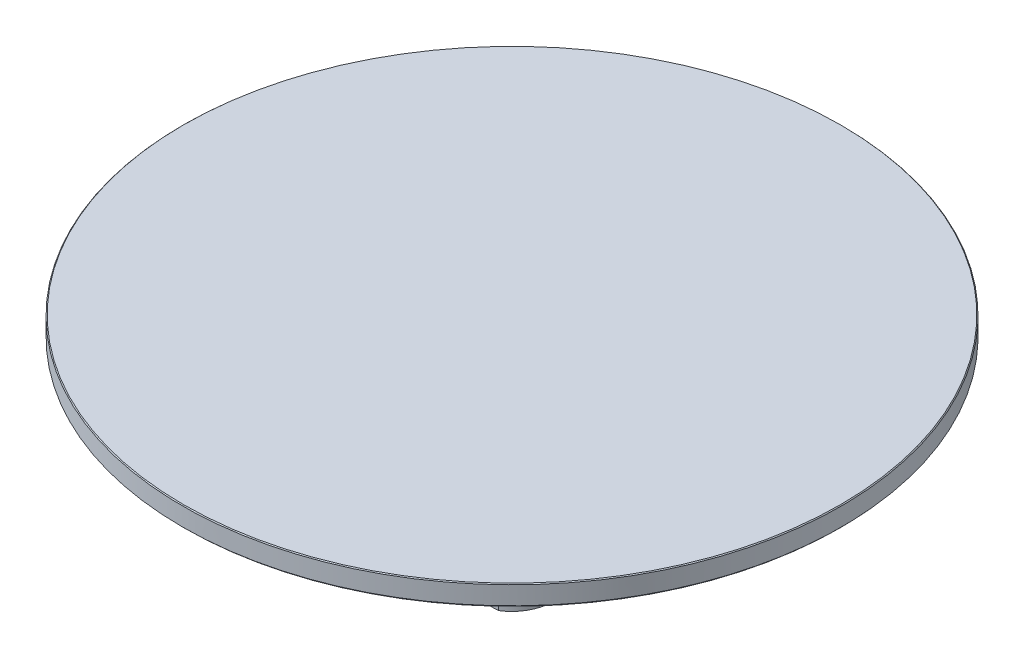
ISO-10303-21;
HEADER;
FILE_DESCRIPTION(('STEP AP214'),'2;1');
FILE_NAME('part.step','',(''),(''),'','','');
FILE_SCHEMA(('AUTOMOTIVE_DESIGN { 1 0 10303 214 1 1 1 1 }'));
ENDSEC;
DATA;
#1=APPLICATION_CONTEXT('core data for automotive mechanical design processes');
#2=APPLICATION_PROTOCOL_DEFINITION('international standard','automotive_design',2000,#1);
#3=PRODUCT_CONTEXT('',#1,'mechanical');
#4=PRODUCT('Part','Part','',(#3));
#5=PRODUCT_RELATED_PRODUCT_CATEGORY('part','',(#4));
#6=PRODUCT_DEFINITION_FORMATION('','',#4);
#7=PRODUCT_DEFINITION_CONTEXT('part definition',#1,'design');
#8=PRODUCT_DEFINITION('design','',#6,#7);
#9=PRODUCT_DEFINITION_SHAPE('','',#8);
#10=(LENGTH_UNIT() NAMED_UNIT(*) SI_UNIT(.MILLI.,.METRE.));
#11=(NAMED_UNIT(*) PLANE_ANGLE_UNIT() SI_UNIT($,.RADIAN.));
#12=(NAMED_UNIT(*) SI_UNIT($,.STERADIAN.) SOLID_ANGLE_UNIT());
#13=UNCERTAINTY_MEASURE_WITH_UNIT(LENGTH_MEASURE(1.E-05),#10,'distance_accuracy_value','');
#14=(GEOMETRIC_REPRESENTATION_CONTEXT(3) GLOBAL_UNCERTAINTY_ASSIGNED_CONTEXT((#13)) GLOBAL_UNIT_ASSIGNED_CONTEXT((#10,
#11,#12)) REPRESENTATION_CONTEXT('',''));
#15=CARTESIAN_POINT('',(0.,0.,0.));
#16=DIRECTION('',(0.,0.,1.));
#17=DIRECTION('',(1.,0.,0.));
#18=AXIS2_PLACEMENT_3D('',#15,#16,#17);
#19=CARTESIAN_POINT('',(0.,5.,0.));
#20=DIRECTION('',(0.,-1.,0.));
#21=DIRECTION('',(0.,0.,-1.));
#22=AXIS2_PLACEMENT_3D('',#19,#20,#21);
#23=CYLINDRICAL_SURFACE('',#22,79.5);
#24=CARTESIAN_POINT('',(0.,0.399999999999998,0.));
#25=DIRECTION('',(0.,1.,0.));
#26=DIRECTION('',(0.,0.,1.));
#27=AXIS2_PLACEMENT_3D('',#24,#25,#26);
#28=CIRCLE('',#27,79.5);
#29=CARTESIAN_POINT('',(0.,0.399999999999998,79.5));
#30=VERTEX_POINT('',#29);
#31=EDGE_CURVE('E90',#30,#30,#28,.T.);
#32=ORIENTED_EDGE('',*,*,#31,.T.);
#33=EDGE_LOOP('',(#32));
#34=FACE_BOUND('',#33,.T.);
#35=CARTESIAN_POINT('',(0.,4.80000000000002,0.));
#36=DIRECTION('',(0.,1.,0.));
#37=DIRECTION('',(0.,0.,1.));
#38=AXIS2_PLACEMENT_3D('',#35,#36,#37);
#39=CIRCLE('',#38,79.5);
#40=CARTESIAN_POINT('',(0.,4.80000000000002,-79.5));
#41=VERTEX_POINT('',#40);
#42=EDGE_CURVE('E91',#41,#41,#39,.F.);
#43=ORIENTED_EDGE('',*,*,#42,.T.);
#44=EDGE_LOOP('',(#43));
#45=FACE_BOUND('',#44,.T.);
#46=ADVANCED_FACE('F36',(#34,#45),#23,.T.);
#47=CARTESIAN_POINT('',(0.,5.,0.));
#48=DIRECTION('',(0.,1.,0.));
#49=DIRECTION('',(0.,0.,1.));
#50=AXIS2_PLACEMENT_3D('',#47,#48,#49);
#51=PLANE('',#50);
#52=CARTESIAN_POINT('',(0.,5.,0.));
#53=DIRECTION('',(0.,1.,0.));
#54=DIRECTION('',(0.,0.,1.));
#55=AXIS2_PLACEMENT_3D('',#52,#53,#54);
#56=CIRCLE('',#55,79.3);
#57=CARTESIAN_POINT('',(0.,5.,-79.3));
#58=VERTEX_POINT('',#57);
#59=EDGE_CURVE('E94',#58,#58,#56,.T.);
#60=ORIENTED_EDGE('',*,*,#59,.T.);
#61=EDGE_LOOP('',(#60));
#62=FACE_BOUND('',#61,.T.);
#63=ADVANCED_FACE('F141',(#62),#51,.T.);
#64=CARTESIAN_POINT('',(0.,0.,0.));
#65=DIRECTION('',(0.,1.,0.));
#66=DIRECTION('',(0.,0.,1.));
#67=AXIS2_PLACEMENT_3D('',#64,#65,#66);
#68=PLANE('',#67);
#69=CARTESIAN_POINT('',(0.,0.,0.));
#70=DIRECTION('',(0.,1.,0.));
#71=DIRECTION('',(0.,0.,1.));
#72=AXIS2_PLACEMENT_3D('',#69,#70,#71);
#73=CIRCLE('',#72,79.1);
#74=CARTESIAN_POINT('',(0.,0.,79.1));
#75=VERTEX_POINT('',#74);
#76=EDGE_CURVE('E109',#75,#75,#73,.F.);
#77=ORIENTED_EDGE('',*,*,#76,.T.);
#78=EDGE_LOOP('',(#77));
#79=FACE_BOUND('',#78,.T.);
#80=DIRECTION('',(0.999524512920494,0.,-0.0308342029416868));
#81=VECTOR('',#80,1.);
#82=CARTESIAN_POINT('',(5.17925593392534,0.,8.84450722035433));
#83=LINE('',#82,#81);
#84=CARTESIAN_POINT('',(-4.72910237713539,0.,9.15016888951091));
#85=VERTEX_POINT('',#84);
#86=CARTESIAN_POINT('',(5.28411803008575,0.,8.84127234305807));
#87=VERTEX_POINT('',#86);
#88=EDGE_CURVE('E104',#85,#87,#83,.T.);
#89=ORIENTED_EDGE('',*,*,#88,.T.);
#90=CARTESIAN_POINT('',(0.,0.,0.));
#91=DIRECTION('',(0.,1.,0.));
#92=DIRECTION('',(0.,0.,1.));
#93=AXIS2_PLACEMENT_3D('',#90,#91,#92);
#94=CIRCLE('',#93,10.3);
#95=EDGE_CURVE('E106',#87,#85,#94,.T.);
#96=ORIENTED_EDGE('',*,*,#95,.T.);
#97=EDGE_LOOP('',(#89,#96));
#98=FACE_BOUND('',#97,.T.);
#99=ADVANCED_FACE('F143',(#79,#98),#68,.F.);
#100=CARTESIAN_POINT('',(0.,-50.,0.));
#101=DIRECTION('',(0.,1.,0.));
#102=DIRECTION('',(0.,0.,1.));
#103=AXIS2_PLACEMENT_3D('',#100,#101,#102);
#104=CYLINDRICAL_SURFACE('',#103,9.9);
#105=DIRECTION('',(0.,1.,0.));
#106=VECTOR('',#105,1.);
#107=CARTESIAN_POINT('',(-4.63657396215165,-50.,8.74712420704641));
#108=LINE('',#107,#106);
#109=CARTESIAN_POINT('',(-4.63657396215165,-50.,8.74712420704641));
#110=VERTEX_POINT('',#109);
#111=CARTESIAN_POINT('',(-4.63657396215165,-0.400000000000011,8.74712420704641));
#112=VERTEX_POINT('',#111);
#113=EDGE_CURVE('E84',#110,#112,#108,.T.);
#114=ORIENTED_EDGE('',*,*,#113,.T.);
#115=CARTESIAN_POINT('',(0.,-0.400000000000011,0.));
#116=DIRECTION('',(0.,1.,0.));
#117=DIRECTION('',(0.,0.,1.));
#118=AXIS2_PLACEMENT_3D('',#115,#116,#117);
#119=CIRCLE('',#118,9.9);
#120=CARTESIAN_POINT('',(5.16692225274867,-0.400000000000011,8.44469741518609));
#121=VERTEX_POINT('',#120);
#122=EDGE_CURVE('E51',#112,#121,#119,.F.);
#123=ORIENTED_EDGE('',*,*,#122,.T.);
#124=DIRECTION('',(0.,1.,0.));
#125=VECTOR('',#124,1.);
#126=CARTESIAN_POINT('',(5.16692225274867,-50.,8.44469741518609));
#127=LINE('',#126,#125);
#128=CARTESIAN_POINT('',(5.16692225274867,-50.,8.44469741518609));
#129=VERTEX_POINT('',#128);
#130=EDGE_CURVE('E79',#121,#129,#127,.F.);
#131=ORIENTED_EDGE('',*,*,#130,.T.);
#132=CARTESIAN_POINT('',(0.,-50.,0.));
#133=DIRECTION('',(0.,-1.,0.));
#134=DIRECTION('',(0.,0.,-1.));
#135=AXIS2_PLACEMENT_3D('',#132,#133,#134);
#136=CIRCLE('',#135,9.9);
#137=EDGE_CURVE('E83',#110,#129,#136,.T.);
#138=ORIENTED_EDGE('',*,*,#137,.F.);
#139=EDGE_LOOP('',(#114,#123,#131,#138));
#140=FACE_BOUND('',#139,.T.);
#141=ADVANCED_FACE('F81',(#140),#104,.T.);
#142=CARTESIAN_POINT('',(0.,-50.,0.));
#143=DIRECTION('',(0.,-1.,0.));
#144=DIRECTION('',(0.,0.,-1.));
#145=AXIS2_PLACEMENT_3D('',#142,#143,#144);
#146=PLANE('',#145);
#147=DIRECTION('',(0.999524512920494,0.,-0.0308342029416868));
#148=VECTOR('',#147,1.);
#149=CARTESIAN_POINT('',(0.265174145298507,-50.,8.59591081111625));
#150=LINE('',#149,#148);
#151=EDGE_CURVE('E87',#110,#129,#150,.T.);
#152=ORIENTED_EDGE('',*,*,#151,.F.);
#153=ORIENTED_EDGE('',*,*,#137,.T.);
#154=EDGE_LOOP('',(#152,#153));
#155=FACE_BOUND('',#154,.T.);
#156=ADVANCED_FACE('F93',(#155),#146,.T.);
#157=CARTESIAN_POINT('',(0.,5.,0.));
#158=DIRECTION('',(0.,-1.,0.));
#159=DIRECTION('',(0.,0.,-1.));
#160=AXIS2_PLACEMENT_3D('',#157,#158,#159);
#161=CONICAL_SURFACE('',#160,79.3,0.785398163397483);
#162=CARTESIAN_POINT('',(0.,4.80000000000002,-79.5));
#163=CARTESIAN_POINT('',(0.,4.80208333333336,-79.4979166666667));
#164=CARTESIAN_POINT('',(0.,4.80416666666669,-79.4958333333333));
#165=CARTESIAN_POINT('',(0.,4.80833333333335,-79.4916666666667));
#166=CARTESIAN_POINT('',(0.,4.81041666666669,-79.4895833333333));
#167=CARTESIAN_POINT('',(0.,4.81458333333335,-79.4854166666667));
#168=CARTESIAN_POINT('',(0.,4.81666666666669,-79.4833333333333));
#169=CARTESIAN_POINT('',(0.,4.82083333333335,-79.4791666666667));
#170=CARTESIAN_POINT('',(0.,4.82291666666669,-79.4770833333333));
#171=CARTESIAN_POINT('',(0.,4.82708333333335,-79.4729166666667));
#172=CARTESIAN_POINT('',(0.,4.82916666666669,-79.4708333333333));
#173=CARTESIAN_POINT('',(0.,4.83333333333335,-79.4666666666667));
#174=CARTESIAN_POINT('',(0.,4.83541666666668,-79.4645833333333));
#175=CARTESIAN_POINT('',(0.,4.83958333333335,-79.4604166666667));
#176=CARTESIAN_POINT('',(0.,4.84166666666668,-79.4583333333333));
#177=CARTESIAN_POINT('',(0.,4.84583333333335,-79.4541666666667));
#178=CARTESIAN_POINT('',(0.,4.84791666666668,-79.4520833333333));
#179=CARTESIAN_POINT('',(0.,4.85208333333335,-79.4479166666667));
#180=CARTESIAN_POINT('',(0.,4.85416666666668,-79.4458333333333));
#181=CARTESIAN_POINT('',(0.,4.85833333333335,-79.4416666666667));
#182=CARTESIAN_POINT('',(0.,4.86041666666668,-79.4395833333333));
#183=CARTESIAN_POINT('',(0.,4.86458333333335,-79.4354166666667));
#184=CARTESIAN_POINT('',(0.,4.86666666666668,-79.4333333333333));
#185=CARTESIAN_POINT('',(0.,4.87083333333335,-79.4291666666667));
#186=CARTESIAN_POINT('',(0.,4.87291666666668,-79.4270833333333));
#187=CARTESIAN_POINT('',(0.,4.87708333333335,-79.4229166666667));
#188=CARTESIAN_POINT('',(0.,4.87916666666668,-79.4208333333333));
#189=CARTESIAN_POINT('',(0.,4.88333333333335,-79.4166666666667));
#190=CARTESIAN_POINT('',(0.,4.88541666666668,-79.4145833333333));
#191=CARTESIAN_POINT('',(0.,4.88958333333335,-79.4104166666667));
#192=CARTESIAN_POINT('',(0.,4.89166666666668,-79.4083333333333));
#193=CARTESIAN_POINT('',(0.,4.89583333333334,-79.4041666666667));
#194=CARTESIAN_POINT('',(0.,4.89791666666668,-79.4020833333334));
#195=CARTESIAN_POINT('',(0.,4.90208333333334,-79.3979166666667));
#196=CARTESIAN_POINT('',(0.,4.90416666666668,-79.3958333333333));
#197=CARTESIAN_POINT('',(0.,4.90833333333334,-79.3916666666667));
#198=CARTESIAN_POINT('',(0.,4.91041666666668,-79.3895833333333));
#199=CARTESIAN_POINT('',(0.,4.91458333333334,-79.3854166666667));
#200=CARTESIAN_POINT('',(0.,4.91666666666668,-79.3833333333333));
#201=CARTESIAN_POINT('',(0.,4.92083333333334,-79.3791666666667));
#202=CARTESIAN_POINT('',(0.,4.92291666666668,-79.3770833333333));
#203=CARTESIAN_POINT('',(0.,4.92708333333334,-79.3729166666667));
#204=CARTESIAN_POINT('',(0.,4.92916666666667,-79.3708333333333));
#205=CARTESIAN_POINT('',(0.,4.93333333333334,-79.3666666666667));
#206=CARTESIAN_POINT('',(0.,4.93541666666667,-79.3645833333333));
#207=CARTESIAN_POINT('',(0.,4.93958333333334,-79.3604166666667));
#208=CARTESIAN_POINT('',(0.,4.94166666666667,-79.3583333333333));
#209=CARTESIAN_POINT('',(0.,4.94583333333334,-79.3541666666667));
#210=CARTESIAN_POINT('',(0.,4.94791666666667,-79.3520833333333));
#211=CARTESIAN_POINT('',(0.,4.95208333333334,-79.3479166666667));
#212=CARTESIAN_POINT('',(0.,4.95416666666667,-79.3458333333333));
#213=CARTESIAN_POINT('',(0.,4.95833333333334,-79.3416666666667));
#214=CARTESIAN_POINT('',(0.,4.96041666666667,-79.3395833333333));
#215=CARTESIAN_POINT('',(0.,4.96458333333334,-79.3354166666667));
#216=CARTESIAN_POINT('',(0.,4.96666666666667,-79.3333333333333));
#217=CARTESIAN_POINT('',(0.,4.97083333333334,-79.3291666666667));
#218=CARTESIAN_POINT('',(0.,4.97291666666667,-79.3270833333333));
#219=CARTESIAN_POINT('',(0.,4.97708333333334,-79.3229166666667));
#220=CARTESIAN_POINT('',(0.,4.97916666666667,-79.3208333333333));
#221=CARTESIAN_POINT('',(0.,4.98333333333334,-79.3166666666667));
#222=CARTESIAN_POINT('',(0.,4.98541666666667,-79.3145833333333));
#223=CARTESIAN_POINT('',(0.,4.98958333333333,-79.3104166666667));
#224=CARTESIAN_POINT('',(0.,4.99166666666667,-79.3083333333333));
#225=CARTESIAN_POINT('',(0.,4.99583333333333,-79.3041666666667));
#226=CARTESIAN_POINT('',(0.,4.99791666666667,-79.3020833333333));
#227=CARTESIAN_POINT('',(0.,5.,-79.3));
#228=B_SPLINE_CURVE_WITH_KNOTS('',3,(#162,#163,#164,#165,#166,#167,#168,#169,#170,#171,#172,
#173,#174,#175,#176,#177,#178,#179,#180,#181,#182,#183,#184,#185,#186,#187,#188,#189,#190,#191,
#192,#193,#194,#195,#196,#197,#198,#199,#200,#201,#202,#203,#204,#205,#206,#207,#208,#209,#210,
#211,#212,#213,#214,#215,#216,#217,#218,#219,#220,#221,#222,#223,#224,#225,#226,#227),
.UNSPECIFIED.,.F.,.F.,(4,2,2,2,2,2,2,2,2,2,2,2,2,2,2,2,2,2,2,2,2,2,2,2,2,2,2,2,2,2,2,2,4),(0.,
0.00883883476483087,0.0176776695296617,0.0265165042944926,0.0353553390593235,0.0441941738241543,
0.0530330085889852,0.0618718433538161,0.070710678118647,0.0795495128834778,0.0883883476483087,
0.0972271824131395,0.10606601717797,0.114904851942801,0.123743686707632,0.132582521472463,
0.141421356237294,0.150260191002125,0.159099025766965,0.167937860531796,0.176776695296627,
0.185615530061458,0.194454364826289,0.20329319959112,0.212132034355951,0.220970869120782,
0.229809703885613,0.238648538650443,0.247487373415274,0.256326208180105,0.265165042944936,
0.274003877709767,0.282842712474598),.UNSPECIFIED.);
#229=EDGE_CURVE('BSEAM133',#41,#58,#228,.T.);
#230=ORIENTED_EDGE('',*,*,#42,.F.);
#231=ORIENTED_EDGE('',*,*,#59,.F.);
#232=ORIENTED_EDGE('',*,*,#229,.T.);
#233=ORIENTED_EDGE('',*,*,#229,.F.);
#234=EDGE_LOOP('',(#230,#232,#231,#233));
#235=FACE_BOUND('',#234,.T.);
#236=ADVANCED_FACE('F133',(#235),#161,.T.);
#237=CARTESIAN_POINT('',(-4.83533980137685,10.3198375526089,8.75325590881592));
#238=DIRECTION('',(-0.0308342029416868,0.,-0.999524512920494));
#239=DIRECTION('',(-0.999524512920494,0.,0.0308342029416868));
#240=AXIS2_PLACEMENT_3D('',#237,#238,#239);
#241=PLANE('',#240);
#242=ORIENTED_EDGE('',*,*,#130,.F.);
#243=DIRECTION('',(-0.999524512920494,0.,0.0308342029416868));
#244=VECTOR('',#243,1.);
#245=CARTESIAN_POINT('',(-4.63657396215165,-0.400000000000012,8.74712420704641));
#246=LINE('',#245,#244);
#247=EDGE_CURVE('E11',#121,#112,#246,.T.);
#248=ORIENTED_EDGE('',*,*,#247,.T.);
#249=ORIENTED_EDGE('',*,*,#113,.F.);
#250=ORIENTED_EDGE('',*,*,#151,.T.);
#251=EDGE_LOOP('',(#242,#248,#249,#250));
#252=FACE_BOUND('',#251,.T.);
#253=ADVANCED_FACE('F88',(#252),#241,.F.);
#254=CARTESIAN_POINT('',(0.,0.399999999999998,0.));
#255=DIRECTION('',(0.,1.,0.));
#256=DIRECTION('',(0.,0.,1.));
#257=AXIS2_PLACEMENT_3D('',#254,#255,#256);
#258=CONICAL_SURFACE('',#257,79.5,0.785398163397448);
#259=ORIENTED_EDGE('',*,*,#76,.F.);
#260=EDGE_LOOP('',(#259));
#261=FACE_BOUND('',#260,.T.);
#262=ORIENTED_EDGE('',*,*,#31,.F.);
#263=EDGE_LOOP('',(#262));
#264=FACE_BOUND('',#263,.T.);
#265=ADVANCED_FACE('F123',(#261,#264),#258,.T.);
#266=CARTESIAN_POINT('',(0.277507826475183,0.,8.99572061628449));
#267=DIRECTION('',(0.0218030739925481,-0.707106781186574,0.706770561048236));
#268=DIRECTION('',(-0.999524512920494,0.,0.0308342029416868));
#269=AXIS2_PLACEMENT_3D('',#266,#267,#268);
#270=PLANE('',#269);
#271=CARTESIAN_POINT('',(5.16692225274867,-0.400000000000011,8.44469741518609));
#272=CARTESIAN_POINT('',(5.18663296696929,-0.333356792135617,8.51076427282528));
#273=CARTESIAN_POINT('',(5.20625463903018,-0.266701854275741,8.57684561289018));
#274=CARTESIAN_POINT('',(5.24531989813619,-0.133368520941567,8.7090372555152));
#275=CARTESIAN_POINT('',(5.26476348518766,-0.0666901254681063,8.7751475580743));
#276=CARTESIAN_POINT('',(5.28411803008575,0.,8.84127234305807));
#277=B_SPLINE_CURVE_WITH_KNOTS('',3,(#271,#272,#273,#274,#275,#276),.UNSPECIFIED.,.F.,.F.,(4,2,
4),(0.,0.287665966605498,0.57533192295624),.UNSPECIFIED.);
#278=EDGE_CURVE('E59',#87,#121,#277,.F.);
#279=ORIENTED_EDGE('',*,*,#278,.F.);
#280=ORIENTED_EDGE('',*,*,#88,.F.);
#281=CARTESIAN_POINT('',(-4.72910237713539,0.,9.15016888951091));
#282=CARTESIAN_POINT('',(-4.71386050596308,-0.0666901254681064,9.08297684414444));
#283=CARTESIAN_POINT('',(-4.69852886926732,-0.133368520941567,9.01579376518767));
#284=CARTESIAN_POINT('',(-4.66768606427914,-0.266701854275741,8.88144553769886));
#285=CARTESIAN_POINT('',(-4.65217489598033,-0.333356792135617,8.81428038916747));
#286=CARTESIAN_POINT('',(-4.63657396215165,-0.400000000000011,8.74712420704641));
#287=B_SPLINE_CURVE_WITH_KNOTS('',3,(#281,#282,#283,#284,#285,#286),.UNSPECIFIED.,.F.,.F.,(4,2,
4),(0.,0.287665956350742,0.575331922956239),.UNSPECIFIED.);
#288=EDGE_CURVE('E42',#112,#85,#287,.F.);
#289=ORIENTED_EDGE('',*,*,#288,.F.);
#290=ORIENTED_EDGE('',*,*,#247,.F.);
#291=EDGE_LOOP('',(#279,#280,#289,#290));
#292=FACE_BOUND('',#291,.T.);
#293=ADVANCED_FACE('F117',(#292),#270,.T.);
#294=CARTESIAN_POINT('',(0.,-0.400000000000011,0.));
#295=DIRECTION('',(0.,1.,0.));
#296=DIRECTION('',(0.,0.,1.));
#297=AXIS2_PLACEMENT_3D('',#294,#295,#296);
#298=CONICAL_SURFACE('',#297,9.9,0.785398163397485);
#299=ORIENTED_EDGE('',*,*,#288,.T.);
#300=ORIENTED_EDGE('',*,*,#95,.F.);
#301=ORIENTED_EDGE('',*,*,#278,.T.);
#302=ORIENTED_EDGE('',*,*,#122,.F.);
#303=EDGE_LOOP('',(#299,#300,#301,#302));
#304=FACE_BOUND('',#303,.T.);
#305=ADVANCED_FACE('F39',(#304),#298,.T.);
#306=CLOSED_SHELL('',(#46,#63,#99,#141,#156,#236,#253,#265,#293,#305));
#307=MANIFOLD_SOLID_BREP('B2',#306);
#308=ADVANCED_BREP_SHAPE_REPRESENTATION('',(#18,#307),#14);
#309=SHAPE_DEFINITION_REPRESENTATION(#9,#308);
ENDSEC;
END-ISO-10303-21;
